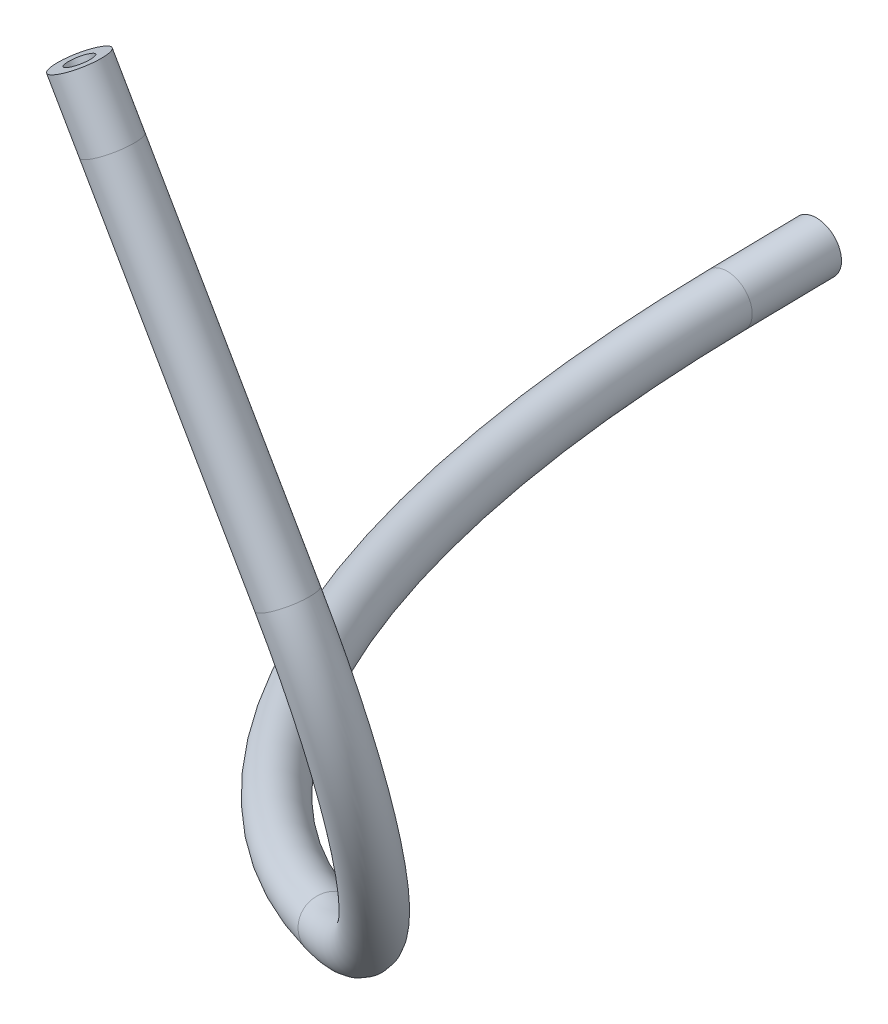
ISO-10303-21;
HEADER;
FILE_DESCRIPTION(('STEP AP214'),'2;1');
FILE_NAME('part.step','',(''),(''),'','','');
FILE_SCHEMA(('AUTOMOTIVE_DESIGN { 1 0 10303 214 1 1 1 1 }'));
ENDSEC;
DATA;
#1=APPLICATION_CONTEXT('core data for automotive mechanical design processes');
#2=APPLICATION_PROTOCOL_DEFINITION('international standard','automotive_design',2000,#1);
#3=PRODUCT_CONTEXT('',#1,'mechanical');
#4=PRODUCT('Part','Part','',(#3));
#5=PRODUCT_RELATED_PRODUCT_CATEGORY('part','',(#4));
#6=PRODUCT_DEFINITION_FORMATION('','',#4);
#7=PRODUCT_DEFINITION_CONTEXT('part definition',#1,'design');
#8=PRODUCT_DEFINITION('design','',#6,#7);
#9=PRODUCT_DEFINITION_SHAPE('','',#8);
#10=(LENGTH_UNIT() NAMED_UNIT(*) SI_UNIT(.MILLI.,.METRE.));
#11=(NAMED_UNIT(*) PLANE_ANGLE_UNIT() SI_UNIT($,.RADIAN.));
#12=(NAMED_UNIT(*) SI_UNIT($,.STERADIAN.) SOLID_ANGLE_UNIT());
#13=UNCERTAINTY_MEASURE_WITH_UNIT(LENGTH_MEASURE(1.E-05),#10,'distance_accuracy_value','');
#14=(GEOMETRIC_REPRESENTATION_CONTEXT(3) GLOBAL_UNCERTAINTY_ASSIGNED_CONTEXT((#13)) GLOBAL_UNIT_ASSIGNED_CONTEXT((#10,
#11,#12)) REPRESENTATION_CONTEXT('',''));
#15=CARTESIAN_POINT('',(0.,0.,0.));
#16=DIRECTION('',(0.,0.,1.));
#17=DIRECTION('',(1.,0.,0.));
#18=AXIS2_PLACEMENT_3D('',#15,#16,#17);
#19=CARTESIAN_POINT('',(117.3830845768,100.679895950769,375.523605045614));
#20=DIRECTION('',(0.500160287594608,-0.865931746946076,0.00137707813697274));
#21=DIRECTION('',(0.865932567999565,0.500160761833312,0.));
#22=AXIS2_PLACEMENT_3D('',#19,#20,#21);
#23=PLANE('',#22);
#24=CARTESIAN_POINT('',(117.383084576799,100.679895950769,375.523605045613));
#25=DIRECTION('',(0.500160287594608,-0.865931746946076,0.00137707813697274));
#26=DIRECTION('',(0.865932567999565,0.500160761833312,0.));
#27=AXIS2_PLACEMENT_3D('',#24,#25,#26);
#28=CIRCLE('',#27,3.175);
#29=CARTESIAN_POINT('',(120.132420480198,102.26790636959,375.523605045613));
#30=VERTEX_POINT('',#29);
#31=EDGE_CURVE('E82',#30,#30,#28,.F.);
#32=ORIENTED_EDGE('',*,*,#31,.F.);
#33=EDGE_LOOP('',(#32));
#34=FACE_BOUND('',#33,.T.);
#35=CARTESIAN_POINT('',(117.3830845768,100.679895950769,375.523605045614));
#36=DIRECTION('',(0.500160287594608,-0.865931746946076,0.00137707813697274));
#37=DIRECTION('',(0.865932567999565,0.500160761833312,0.));
#38=AXIS2_PLACEMENT_3D('',#35,#36,#37);
#39=CIRCLE('',#38,6.35);
#40=CARTESIAN_POINT('',(122.881756383597,103.855916788411,375.523605045614));
#41=VERTEX_POINT('',#40);
#42=EDGE_CURVE('E79',#41,#41,#39,.T.);
#43=ORIENTED_EDGE('',*,*,#42,.F.);
#44=EDGE_LOOP('',(#43));
#45=FACE_BOUND('',#44,.T.);
#46=ADVANCED_FACE('F57',(#34,#45),#23,.F.);
#47=CARTESIAN_POINT('',(2.32958402032676,-149.377887397441,72.5491350746658));
#48=DIRECTION('',(-0.00872620321861624,0.00872653549839828,-0.999923847578196));
#49=DIRECTION('',(0.787783334007958,-0.615830635713522,-0.0122493581866392));
#50=AXIS2_PLACEMENT_3D('',#47,#48,#49);
#51=PLANE('',#50);
#52=CARTESIAN_POINT('',(2.32958402032682,-149.377887397441,72.5491350746658));
#53=DIRECTION('',(-0.00872620321861624,0.00872653549839828,-0.999923847578196));
#54=DIRECTION('',(0.,0.999961920164465,0.00872686776547682));
#55=AXIS2_PLACEMENT_3D('',#52,#53,#54);
#56=CIRCLE('',#55,3.175);
#57=CARTESIAN_POINT('',(2.32958402032682,-146.203008300919,72.5768428798212));
#58=VERTEX_POINT('',#57);
#59=EDGE_CURVE('E83',#58,#58,#56,.F.);
#60=ORIENTED_EDGE('',*,*,#59,.T.);
#61=EDGE_LOOP('',(#60));
#62=FACE_BOUND('',#61,.T.);
#63=CARTESIAN_POINT('',(2.32958402032676,-149.377887397441,72.5491350746658));
#64=DIRECTION('',(-0.00872620321861624,0.00872653549839828,-0.999923847578196));
#65=DIRECTION('',(0.787783334007958,-0.615830635713522,-0.0122493581866392));
#66=AXIS2_PLACEMENT_3D('',#63,#64,#65);
#67=CIRCLE('',#66,6.35);
#68=CARTESIAN_POINT('',(2.32958402032675,-143.028129204397,72.6045506849766));
#69=VERTEX_POINT('',#68);
#70=EDGE_CURVE('E11',#69,#69,#67,.T.);
#71=ORIENTED_EDGE('',*,*,#70,.T.);
#72=EDGE_LOOP('',(#71));
#73=FACE_BOUND('',#72,.T.);
#74=ADVANCED_FACE('F106',(#62,#73),#51,.T.);
#75=CARTESIAN_POINT('',(117.3830845768,100.679895950769,375.523605045614));
#76=DIRECTION('',(0.500160287594612,-0.865931746946074,0.00137707813696943));
#77=DIRECTION('',(0.865932567999563,0.500160761833315,0.));
#78=AXIS2_PLACEMENT_3D('',#75,#76,#77);
#79=CYLINDRICAL_SURFACE('',#78,6.35);
#80=CARTESIAN_POINT('',(125.768271797323,86.16255021495,375.546691760577));
#81=DIRECTION('',(0.500160287594608,-0.865931746946076,0.00137707813697274));
#82=DIRECTION('',(0.865932567999565,0.500160761833312,0.));
#83=AXIS2_PLACEMENT_3D('',#80,#81,#82);
#84=CIRCLE('',#83,6.35);
#85=CARTESIAN_POINT('',(131.26694360412,89.3385710525915,375.546691760577));
#86=VERTEX_POINT('',#85);
#87=EDGE_CURVE('E76',#86,#86,#84,.T.);
#88=CARTESIAN_POINT('',(131.26694360412,89.3385710525915,375.546691760577));
#89=CARTESIAN_POINT('',(131.179597903906,89.4897934040063,375.546451273963));
#90=CARTESIAN_POINT('',(131.092252203693,89.6410157554211,375.546210787349));
#91=CARTESIAN_POINT('',(130.917560803265,89.9434604582506,375.54572981412));
#92=CARTESIAN_POINT('',(130.830215103051,90.0946828096654,375.545489327506));
#93=CARTESIAN_POINT('',(130.655523702624,90.397127512495,375.545008354278));
#94=CARTESIAN_POINT('',(130.56817800241,90.5483498639098,375.544767867663));
#95=CARTESIAN_POINT('',(130.393486601982,90.8507945667393,375.544286894435));
#96=CARTESIAN_POINT('',(130.306140901769,91.0020169181541,375.544046407821));
#97=CARTESIAN_POINT('',(130.131449501341,91.3044616209837,375.543565434592));
#98=CARTESIAN_POINT('',(130.044103801127,91.4556839723985,375.543324947978));
#99=CARTESIAN_POINT('',(129.8694124007,91.758128675228,375.54284397475));
#100=CARTESIAN_POINT('',(129.782066700486,91.9093510266428,375.542603488136));
#101=CARTESIAN_POINT('',(129.607375300058,92.2117957294724,375.542122514907));
#102=CARTESIAN_POINT('',(129.520029599844,92.3630180808871,375.541882028293));
#103=CARTESIAN_POINT('',(129.345338199417,92.6654627837167,375.541401055065));
#104=CARTESIAN_POINT('',(129.257992499203,92.8166851351315,375.54116056845));
#105=CARTESIAN_POINT('',(129.083301098776,93.1191298379611,375.540679595222));
#106=CARTESIAN_POINT('',(128.995955398562,93.2703521893758,375.540439108608));
#107=CARTESIAN_POINT('',(128.821263998134,93.5727968922054,375.539958135379));
#108=CARTESIAN_POINT('',(128.73391829792,93.7240192436202,375.539717648765));
#109=CARTESIAN_POINT('',(128.559226897493,94.0264639464497,375.539236675537));
#110=CARTESIAN_POINT('',(128.471881197279,94.1776862978645,375.538996188923));
#111=CARTESIAN_POINT('',(128.297189796851,94.4801310006941,375.538515215694));
#112=CARTESIAN_POINT('',(128.209844096638,94.6313533521089,375.53827472908));
#113=CARTESIAN_POINT('',(128.03515269621,94.9337980549384,375.537793755852));
#114=CARTESIAN_POINT('',(127.947806995996,95.0850204063532,375.537553269237));
#115=CARTESIAN_POINT('',(127.773115595569,95.3874651091828,375.537072296009));
#116=CARTESIAN_POINT('',(127.685769895355,95.5386874605976,375.536831809395));
#117=CARTESIAN_POINT('',(127.511078494927,95.8411321634271,375.536350836166));
#118=CARTESIAN_POINT('',(127.423732794714,95.9923545148419,375.536110349552));
#119=CARTESIAN_POINT('',(127.249041394286,96.2947992176715,375.535629376324));
#120=CARTESIAN_POINT('',(127.161695694072,96.4460215690863,375.535388889709));
#121=CARTESIAN_POINT('',(126.987004293645,96.7484662719158,375.534907916481));
#122=CARTESIAN_POINT('',(126.899658593431,96.8996886233306,375.534667429867));
#123=CARTESIAN_POINT('',(126.724967193003,97.2021333261602,375.534186456638));
#124=CARTESIAN_POINT('',(126.63762149279,97.353355677575,375.533945970024));
#125=CARTESIAN_POINT('',(126.462930092362,97.6558003804045,375.533464996796));
#126=CARTESIAN_POINT('',(126.375584392148,97.8070227318193,375.533224510182));
#127=CARTESIAN_POINT('',(126.200892991721,98.1094674346489,375.532743536953));
#128=CARTESIAN_POINT('',(126.113547291507,98.2606897860636,375.532503050339));
#129=CARTESIAN_POINT('',(125.938855891079,98.5631344888932,375.532022077111));
#130=CARTESIAN_POINT('',(125.851510190865,98.714356840308,375.531781590496));
#131=CARTESIAN_POINT('',(125.676818790438,99.0168015431375,375.531300617268));
#132=CARTESIAN_POINT('',(125.589473090224,99.1680238945523,375.531060130654));
#133=CARTESIAN_POINT('',(125.414781689797,99.4704685973819,375.530579157425));
#134=CARTESIAN_POINT('',(125.327435989583,99.6216909487967,375.530338670811));
#135=CARTESIAN_POINT('',(125.152744589155,99.9241356516262,375.529857697583));
#136=CARTESIAN_POINT('',(125.065398888941,100.075358003041,375.529617210969));
#137=CARTESIAN_POINT('',(124.890707488514,100.377802705871,375.52913623774));
#138=CARTESIAN_POINT('',(124.8033617883,100.529025057285,375.528895751126));
#139=CARTESIAN_POINT('',(124.628670387873,100.831469760115,375.528414777898));
#140=CARTESIAN_POINT('',(124.541324687659,100.98269211153,375.528174291283));
#141=CARTESIAN_POINT('',(124.366633287231,101.285136814359,375.527693318055));
#142=CARTESIAN_POINT('',(124.279287587017,101.436359165774,375.527452831441));
#143=CARTESIAN_POINT('',(124.10459618659,101.738803868604,375.526971858212));
#144=CARTESIAN_POINT('',(124.017250486376,101.890026220018,375.526731371598));
#145=CARTESIAN_POINT('',(123.842559085948,102.192470922848,375.52625039837));
#146=CARTESIAN_POINT('',(123.755213385735,102.343693274263,375.526009911756));
#147=CARTESIAN_POINT('',(123.580521985307,102.646137977092,375.525528938527));
#148=CARTESIAN_POINT('',(123.493176285093,102.797360328507,375.525288451913));
#149=CARTESIAN_POINT('',(123.318484884666,103.099805031337,375.524807478685));
#150=CARTESIAN_POINT('',(123.231139184452,103.251027382751,375.52456699207));
#151=CARTESIAN_POINT('',(123.056447784024,103.553472085581,375.524086018842));
#152=CARTESIAN_POINT('',(122.969102083811,103.704694436996,375.523845532228));
#153=CARTESIAN_POINT('',(122.881756383597,103.855916788411,375.523605045614));
#154=B_SPLINE_CURVE_WITH_KNOTS('',3,(#88,#89,#90,#91,#92,#93,#94,#95,#96,#97,#98,#99,#100,#101,
#102,#103,#104,#105,#106,#107,#108,#109,#110,#111,#112,#113,#114,#115,#116,#117,#118,#119,#120,
#121,#122,#123,#124,#125,#126,#127,#128,#129,#130,#131,#132,#133,#134,#135,#136,#137,#138,#139,
#140,#141,#142,#143,#144,#145,#146,#147,#148,#149,#150,#151,#152,#153),.UNSPECIFIED.,.F.,.F.,(4,
2,2,2,2,2,2,2,2,2,2,2,2,2,2,2,2,2,2,2,2,2,2,2,2,2,2,2,2,2,2,2,4),(0.,0.523906249937489,
1.04781249987499,1.57171874981249,2.09562499974999,2.61953124968749,3.14343749962499,
3.66734374956248,4.1912499995,4.7151562494375,5.23906249937499,5.76296874931249,
6.28687499924999,6.81078124918748,7.33468749912499,7.85859374906249,8.38249999899998,
8.90640624893748,9.43031249887498,9.9542187488125,10.47812499875,11.0020312486875,
11.525937498625,12.0498437485625,12.5737499985,13.0976562484375,13.621562498375,
14.1454687483125,14.66937499825,15.1932812481875,15.717187498125,16.2410937480625,16.764999998),.UNSPECIFIED.);
#155=EDGE_CURVE('BSEAM110',#86,#41,#154,.T.);
#156=ORIENTED_EDGE('',*,*,#87,.F.);
#157=ORIENTED_EDGE('',*,*,#42,.T.);
#158=ORIENTED_EDGE('',*,*,#155,.T.);
#159=ORIENTED_EDGE('',*,*,#155,.F.);
#160=EDGE_LOOP('',(#156,#158,#157,#159));
#161=FACE_BOUND('',#160,.T.);
#162=ADVANCED_FACE('F110',(#161),#79,.T.);
#163=CARTESIAN_POINT('',(125.768271797323,86.1625502149492,375.546691760577));
#164=DIRECTION('',(0.50016028759461,-0.865931746946075,0.00137707813697262));
#165=DIRECTION('',(0.865932567999564,0.500160761833314,0.));
#166=AXIS2_PLACEMENT_3D('',#163,#164,#165);
#167=CYLINDRICAL_SURFACE('',#166,6.35);
#168=CARTESIAN_POINT('',(170.626097363609,8.49981644689048,375.670197629379));
#169=DIRECTION('',(0.500160287594608,-0.865931746946076,0.00137707813697274));
#170=DIRECTION('',(0.865932567999565,0.500160761833312,0.));
#171=AXIS2_PLACEMENT_3D('',#168,#169,#170);
#172=CIRCLE('',#171,6.35);
#173=CARTESIAN_POINT('',(175.5017500305,11.3206446401772,378.601654498548));
#174=VERTEX_POINT('',#173);
#175=EDGE_CURVE('E71',#174,#174,#172,.T.);
#176=ORIENTED_EDGE('',*,*,#175,.F.);
#177=EDGE_LOOP('',(#176));
#178=FACE_BOUND('',#177,.T.);
#179=ORIENTED_EDGE('',*,*,#87,.T.);
#180=EDGE_LOOP('',(#179));
#181=FACE_BOUND('',#180,.T.);
#182=ADVANCED_FACE('F112',(#178,#181),#167,.T.);
#183=CARTESIAN_POINT('',(109.788583018881,-26.697968833932,339.092007689783));
#184=DIRECTION('',(0.400366310023597,0.229840024576977,-0.887062782953125));
#185=DIRECTION('',(-0.911464114793994,0.,-0.41137959045485));
#186=AXIS2_PLACEMENT_3D('',#183,#184,#185);
#187=TOROIDAL_SURFACE('',#186,79.2341543753517,6.35);
#188=CARTESIAN_POINT('',(140.15053387911,-99.6983010280906,333.880994440848));
#189=DIRECTION('',(-0.832388226590025,-0.313585002274352,-0.456940134572252));
#190=DIRECTION('',(0.524744301368592,-0.711168051587973,-0.467849784206163));
#191=AXIS2_PLACEMENT_3D('',#188,#189,#190);
#192=CIRCLE('',#191,6.35);
#193=CARTESIAN_POINT('',(142.58380762933,-105.548708760556,333.463372338466));
#194=VERTEX_POINT('',#193);
#195=EDGE_CURVE('E67',#194,#194,#192,.T.);
#196=CARTESIAN_POINT('',(109.788583018881,-26.697968833932,339.092007689783));
#197=DIRECTION('',(0.400366310023597,0.229840024576977,-0.887062782953125));
#198=DIRECTION('',(-0.911464114793994,0.,-0.41137959045485));
#199=AXIS2_PLACEMENT_3D('',#196,#197,#198);
#200=CIRCLE('',#199,85.5841543753517);
#201=EDGE_CURVE('',#174,#194,#200,.T.);
#202=ORIENTED_EDGE('',*,*,#175,.T.);
#203=ORIENTED_EDGE('',*,*,#195,.F.);
#204=ORIENTED_EDGE('',*,*,#201,.T.);
#205=ORIENTED_EDGE('',*,*,#201,.F.);
#206=EDGE_LOOP('',(#202,#204,#203,#205));
#207=FACE_BOUND('',#206,.T.);
#208=ADVANCED_FACE('F119',(#207),#187,.T.);
#209=CARTESIAN_POINT('',(254.186385860919,-53.0878184491065,94.1593315869177));
#210=DIRECTION('',(0.357932196212308,-0.933679540387756,-0.0112720351287278));
#211=DIRECTION('',(0.933738862130589,0.357954937592811,0.));
#212=AXIS2_PLACEMENT_3D('',#209,#210,#211);
#213=TOROIDAL_SURFACE('',#212,269.524003133147,6.35);
#214=CARTESIAN_POINT('',(2.52999022834996,-149.578301236611,95.5134119296652));
#215=DIRECTION('',(-0.00872620321861569,0.00872653549839851,-0.999923847578196));
#216=DIRECTION('',(0.787783334007958,-0.615830635713522,-0.0122493581866387));
#217=AXIS2_PLACEMENT_3D('',#214,#215,#216);
#218=CIRCLE('',#217,6.35);
#219=CARTESIAN_POINT('',(2.52999022835,-143.228543043566,95.568827539976));
#220=VERTEX_POINT('',#219);
#221=EDGE_CURVE('E63',#220,#220,#218,.T.);
#222=ORIENTED_EDGE('',*,*,#221,.F.);
#223=EDGE_LOOP('',(#222));
#224=FACE_BOUND('',#223,.T.);
#225=ORIENTED_EDGE('',*,*,#195,.T.);
#226=EDGE_LOOP('',(#225));
#227=FACE_BOUND('',#226,.T.);
#228=ADVANCED_FACE('F127',(#224,#227),#213,.T.);
#229=CARTESIAN_POINT('',(2.52999022835,-149.578301236611,95.5134119296651));
#230=DIRECTION('',(-0.00872620321861079,0.00872653549839816,-0.999923847578196));
#231=DIRECTION('',(0.,0.999961920164465,0.0087268677654767));
#232=AXIS2_PLACEMENT_3D('',#229,#230,#231);
#233=CYLINDRICAL_SURFACE('',#232,6.35);
#234=CARTESIAN_POINT('',(2.32958402032675,-143.028129204397,72.6045506849766));
#235=CARTESIAN_POINT('',(2.33167158499366,-143.030216848555,72.8437619022162));
#236=CARTESIAN_POINT('',(2.33375914966057,-143.032304492713,73.0829731194557));
#237=CARTESIAN_POINT('',(2.33793427899439,-143.036479781029,73.5613955539349));
#238=CARTESIAN_POINT('',(2.3400218436613,-143.038567425187,73.8006067711745));
#239=CARTESIAN_POINT('',(2.34419697299511,-143.042742713503,74.2790292056536));
#240=CARTESIAN_POINT('',(2.34628453766202,-143.044830357661,74.5182404228932));
#241=CARTESIAN_POINT('',(2.35045966699584,-143.049005645977,74.9966628573723));
#242=CARTESIAN_POINT('',(2.35254723166275,-143.051093290135,75.2358740746119));
#243=CARTESIAN_POINT('',(2.35672236099657,-143.055268578451,75.7142965090911));
#244=CARTESIAN_POINT('',(2.35880992566348,-143.057356222609,75.9535077263307));
#245=CARTESIAN_POINT('',(2.36298505499729,-143.061531510925,76.4319301608098));
#246=CARTESIAN_POINT('',(2.3650726196642,-143.063619155083,76.6711413780494));
#247=CARTESIAN_POINT('',(2.36924774899802,-143.067794443399,77.1495638125285));
#248=CARTESIAN_POINT('',(2.37133531366493,-143.069882087557,77.3887750297681));
#249=CARTESIAN_POINT('',(2.37551044299875,-143.074057375873,77.8671974642473));
#250=CARTESIAN_POINT('',(2.37759800766566,-143.076145020031,78.1064086814869));
#251=CARTESIAN_POINT('',(2.38177313699947,-143.080320308347,78.584831115966));
#252=CARTESIAN_POINT('',(2.38386070166638,-143.082407952505,78.8240423332056));
#253=CARTESIAN_POINT('',(2.3880358310002,-143.086583240821,79.3024647676847));
#254=CARTESIAN_POINT('',(2.39012339566711,-143.088670884979,79.5416759849243));
#255=CARTESIAN_POINT('',(2.39429852500093,-143.092846173295,80.0200984194035));
#256=CARTESIAN_POINT('',(2.39638608966783,-143.094933817453,80.259309636643));
#257=CARTESIAN_POINT('',(2.40056121900165,-143.099109105769,80.7377320711222));
#258=CARTESIAN_POINT('',(2.40264878366856,-143.101196749927,80.9769432883618));
#259=CARTESIAN_POINT('',(2.40682391300238,-143.105372038244,81.4553657228409));
#260=CARTESIAN_POINT('',(2.40891147766929,-143.107459682402,81.6945769400805));
#261=CARTESIAN_POINT('',(2.41308660700311,-143.111634970718,82.1729993745597));
#262=CARTESIAN_POINT('',(2.41517417167001,-143.113722614876,82.4122105917992));
#263=CARTESIAN_POINT('',(2.41934930100383,-143.117897903192,82.8906330262784));
#264=CARTESIAN_POINT('',(2.42143686567074,-143.11998554735,83.129844243518));
#265=CARTESIAN_POINT('',(2.42561199500456,-143.124160835666,83.6082666779971));
#266=CARTESIAN_POINT('',(2.42769955967147,-143.126248479824,83.8474778952367));
#267=CARTESIAN_POINT('',(2.43187468900529,-143.13042376814,84.3259003297159));
#268=CARTESIAN_POINT('',(2.43396225367219,-143.132511412298,84.5651115469554));
#269=CARTESIAN_POINT('',(2.43813738300601,-143.136686700614,85.0435339814346));
#270=CARTESIAN_POINT('',(2.44022494767292,-143.138774344772,85.2827451986741));
#271=CARTESIAN_POINT('',(2.44440007700674,-143.142949633088,85.7611676331533));
#272=CARTESIAN_POINT('',(2.44648764167365,-143.145037277246,86.0003788503929));
#273=CARTESIAN_POINT('',(2.45066277100746,-143.149212565562,86.478801284872));
#274=CARTESIAN_POINT('',(2.45275033567437,-143.15130020972,86.7180125021116));
#275=CARTESIAN_POINT('',(2.45692546500819,-143.155475498036,87.1964349365908));
#276=CARTESIAN_POINT('',(2.4590130296751,-143.157563142194,87.4356461538304));
#277=CARTESIAN_POINT('',(2.46318815900892,-143.16173843051,87.9140685883095));
#278=CARTESIAN_POINT('',(2.46527572367583,-143.163826074668,88.1532798055491));
#279=CARTESIAN_POINT('',(2.46945085300964,-143.168001362984,88.6317022400282));
#280=CARTESIAN_POINT('',(2.47153841767655,-143.170089007142,88.8709134572678));
#281=CARTESIAN_POINT('',(2.47571354701037,-143.174264295458,89.349335891747));
#282=CARTESIAN_POINT('',(2.47780111167728,-143.176351939616,89.5885471089865));
#283=CARTESIAN_POINT('',(2.4819762410111,-143.180527227932,90.0669695434657));
#284=CARTESIAN_POINT('',(2.48406380567801,-143.18261487209,90.3061807607053));
#285=CARTESIAN_POINT('',(2.48823893501182,-143.186790160406,90.7846031951844));
#286=CARTESIAN_POINT('',(2.49032649967873,-143.188877804564,91.023814412424));
#287=CARTESIAN_POINT('',(2.49450162901255,-143.19305309288,91.5022368469032));
#288=CARTESIAN_POINT('',(2.49658919367946,-143.195140737038,91.7414480641427));
#289=CARTESIAN_POINT('',(2.50076432301328,-143.199316025354,92.2198704986219));
#290=CARTESIAN_POINT('',(2.50285188768019,-143.201403669512,92.4590817158615));
#291=CARTESIAN_POINT('',(2.507027017014,-143.205578957828,92.9375041503406));
#292=CARTESIAN_POINT('',(2.50911458168091,-143.207666601986,93.1767153675802));
#293=CARTESIAN_POINT('',(2.51328971101473,-143.211841890302,93.6551378020593));
#294=CARTESIAN_POINT('',(2.51537727568164,-143.21392953446,93.8943490192989));
#295=CARTESIAN_POINT('',(2.51955240501546,-143.218104822776,94.3727714537781));
#296=CARTESIAN_POINT('',(2.52163996968237,-143.220192466934,94.6119826710177));
#297=CARTESIAN_POINT('',(2.52581509901618,-143.22436775525,95.0904051054968));
#298=CARTESIAN_POINT('',(2.52790266368309,-143.226455399408,95.3296163227364));
#299=CARTESIAN_POINT('',(2.52999022835,-143.228543043566,95.568827539976));
#300=B_SPLINE_CURVE_WITH_KNOTS('',3,(#234,#235,#236,#237,#238,#239,#240,#241,#242,#243,#244,
#245,#246,#247,#248,#249,#250,#251,#252,#253,#254,#255,#256,#257,#258,#259,#260,#261,#262,#263,
#264,#265,#266,#267,#268,#269,#270,#271,#272,#273,#274,#275,#276,#277,#278,#279,#280,#281,#282,
#283,#284,#285,#286,#287,#288,#289,#290,#291,#292,#293,#294,#295,#296,#297,#298,#299),
.UNSPECIFIED.,.F.,.F.,(4,2,2,2,2,2,2,2,2,2,2,2,2,2,2,2,2,2,2,2,2,2,2,2,2,2,2,2,2,2,2,2,4),(0.,
0.717688305421288,1.43537661084258,2.15306491626386,2.87075322168515,3.58844152710644,
4.30612983252773,5.02381813794903,5.74150644337032,6.45919474879161,7.1768830542129,
7.89457135963418,8.61225966505547,9.32994797047676,10.047636275898,10.7653245813193,
11.4830128867406,12.2007011921619,12.9183894975832,13.6360778030045,14.3537661084258,
15.0714544138471,15.7891427192684,16.5068310246897,17.224519330111,17.9422076355322,
18.6598959409535,19.3775842463748,20.0952725517961,20.8129608572174,21.5306491626387,
22.24833746806,22.9660257734813),.UNSPECIFIED.);
#301=EDGE_CURVE('BSEAM125',#69,#220,#300,.T.);
#302=ORIENTED_EDGE('',*,*,#70,.F.);
#303=ORIENTED_EDGE('',*,*,#221,.T.);
#304=ORIENTED_EDGE('',*,*,#301,.T.);
#305=ORIENTED_EDGE('',*,*,#301,.F.);
#306=EDGE_LOOP('',(#302,#304,#303,#305));
#307=FACE_BOUND('',#306,.T.);
#308=ADVANCED_FACE('F125',(#307),#233,.T.);
#309=CARTESIAN_POINT('',(2.52999022835007,-149.578301236611,95.5134119296651));
#310=DIRECTION('',(-0.0087262032186108,0.00872653549839834,-0.999923847578196));
#311=DIRECTION('',(0.,0.999961920164465,0.00872686776547687));
#312=AXIS2_PLACEMENT_3D('',#309,#310,#311);
#313=CYLINDRICAL_SURFACE('',#312,3.175);
#314=CARTESIAN_POINT('',(2.52999022834999,-149.578301236611,95.5134119296652));
#315=DIRECTION('',(-0.00872620321860703,0.00872653549841605,-0.999923847578196));
#316=DIRECTION('',(0.787783334007958,-0.615830635713522,-0.012249358186643));
#317=AXIS2_PLACEMENT_3D('',#314,#315,#316);
#318=CIRCLE('',#317,3.175);
#319=CARTESIAN_POINT('',(5.03120231382525,-151.533563505001,95.4745202174226));
#320=VERTEX_POINT('',#319);
#321=EDGE_CURVE('E87',#320,#320,#318,.T.);
#322=ORIENTED_EDGE('',*,*,#321,.F.);
#323=EDGE_LOOP('',(#322));
#324=FACE_BOUND('',#323,.T.);
#325=ORIENTED_EDGE('',*,*,#59,.F.);
#326=EDGE_LOOP('',(#325));
#327=FACE_BOUND('',#326,.T.);
#328=ADVANCED_FACE('F107',(#324,#327),#313,.F.);
#329=CARTESIAN_POINT('',(115.382443426433,104.143622938532,375.518096733066));
#330=DIRECTION('',(0.500160287594612,-0.865931746946074,0.00137707813697044));
#331=DIRECTION('',(0.865932567999563,0.500160761833315,0.));
#332=AXIS2_PLACEMENT_3D('',#329,#330,#331);
#333=CYLINDRICAL_SURFACE('',#332,3.175);
#334=ORIENTED_EDGE('',*,*,#31,.T.);
#335=EDGE_LOOP('',(#334));
#336=FACE_BOUND('',#335,.T.);
#337=CARTESIAN_POINT('',(125.768271797319,86.1625502149556,375.546691760577));
#338=DIRECTION('',(0.500160287594608,-0.865931746946076,0.00137707813697274));
#339=DIRECTION('',(0.865932567999565,0.500160761833312,0.));
#340=AXIS2_PLACEMENT_3D('',#337,#338,#339);
#341=CIRCLE('',#340,3.175);
#342=CARTESIAN_POINT('',(128.517607700718,87.7505606337764,375.546691760577));
#343=VERTEX_POINT('',#342);
#344=EDGE_CURVE('E86',#343,#343,#341,.T.);
#345=ORIENTED_EDGE('',*,*,#344,.T.);
#346=EDGE_LOOP('',(#345));
#347=FACE_BOUND('',#346,.T.);
#348=ADVANCED_FACE('F101',(#336,#347),#333,.F.);
#349=CARTESIAN_POINT('',(125.768271797319,86.1625502149558,375.546691760576));
#350=DIRECTION('',(0.50016028759461,-0.865931746946075,0.00137707813697262));
#351=DIRECTION('',(0.865932567999564,0.500160761833314,0.));
#352=AXIS2_PLACEMENT_3D('',#349,#350,#351);
#353=CYLINDRICAL_SURFACE('',#352,3.175);
#354=CARTESIAN_POINT('',(170.626097363605,8.49981644689714,375.670197629378));
#355=DIRECTION('',(0.500160287594608,-0.865931746946076,0.00137707813697274));
#356=DIRECTION('',(0.865932567999565,0.500160761833312,0.));
#357=AXIS2_PLACEMENT_3D('',#354,#355,#356);
#358=CIRCLE('',#357,3.175);
#359=CARTESIAN_POINT('',(173.06392369705,9.91023054354077,377.135926063963));
#360=VERTEX_POINT('',#359);
#361=EDGE_CURVE('E90',#360,#360,#358,.T.);
#362=ORIENTED_EDGE('',*,*,#361,.T.);
#363=EDGE_LOOP('',(#362));
#364=FACE_BOUND('',#363,.T.);
#365=ORIENTED_EDGE('',*,*,#344,.F.);
#366=EDGE_LOOP('',(#365));
#367=FACE_BOUND('',#366,.T.);
#368=ADVANCED_FACE('F186',(#364,#367),#353,.F.);
#369=CARTESIAN_POINT('',(109.788583018881,-26.6979688339319,339.092007689782));
#370=DIRECTION('',(0.400366310023597,0.229840024576977,-0.887062782953125));
#371=DIRECTION('',(-0.911464114793994,0.,-0.41137959045485));
#372=AXIS2_PLACEMENT_3D('',#369,#370,#371);
#373=TOROIDAL_SURFACE('',#372,79.2341543753513,3.175);
#374=CARTESIAN_POINT('',(140.15053387911,-99.6983010280906,333.880994440848));
#375=DIRECTION('',(-0.832388226590024,-0.313585002274337,-0.456940134572265));
#376=DIRECTION('',(0.524744301368589,-0.711168051587975,-0.467849784206165));
#377=AXIS2_PLACEMENT_3D('',#374,#375,#376);
#378=CIRCLE('',#377,3.175);
#379=CARTESIAN_POINT('',(141.36717075422,-102.623504894323,333.672183389657));
#380=VERTEX_POINT('',#379);
#381=EDGE_CURVE('E93',#380,#380,#378,.T.);
#382=CARTESIAN_POINT('',(109.788583018881,-26.6979688339319,339.092007689782));
#383=DIRECTION('',(0.400366310023597,0.229840024576977,-0.887062782953125));
#384=DIRECTION('',(-0.911464114793994,0.,-0.41137959045485));
#385=AXIS2_PLACEMENT_3D('',#382,#383,#384);
#386=CIRCLE('',#385,82.4091543753513);
#387=EDGE_CURVE('',#360,#380,#386,.T.);
#388=ORIENTED_EDGE('',*,*,#361,.F.);
#389=ORIENTED_EDGE('',*,*,#381,.T.);
#390=ORIENTED_EDGE('',*,*,#387,.T.);
#391=ORIENTED_EDGE('',*,*,#387,.F.);
#392=EDGE_LOOP('',(#388,#390,#389,#391));
#393=FACE_BOUND('',#392,.T.);
#394=ADVANCED_FACE('F195',(#393),#373,.F.);
#395=CARTESIAN_POINT('',(254.186385860919,-53.0878184491065,94.1593315869177));
#396=DIRECTION('',(0.357932196212308,-0.933679540387756,-0.0112720351287278));
#397=DIRECTION('',(0.933738862130589,0.357954937592811,0.));
#398=AXIS2_PLACEMENT_3D('',#395,#396,#397);
#399=TOROIDAL_SURFACE('',#398,269.524003133147,3.175);
#400=ORIENTED_EDGE('',*,*,#321,.T.);
#401=EDGE_LOOP('',(#400));
#402=FACE_BOUND('',#401,.T.);
#403=ORIENTED_EDGE('',*,*,#381,.F.);
#404=EDGE_LOOP('',(#403));
#405=FACE_BOUND('',#404,.T.);
#406=ADVANCED_FACE('F135',(#402,#405),#399,.F.);
#407=CLOSED_SHELL('',(#46,#74,#162,#182,#208,#228,#308,#328,#348,#368,#394,#406));
#408=MANIFOLD_SOLID_BREP('B2',#407);
#409=ADVANCED_BREP_SHAPE_REPRESENTATION('',(#18,#408),#14);
#410=SHAPE_DEFINITION_REPRESENTATION(#9,#409);
ENDSEC;
END-ISO-10303-21;
